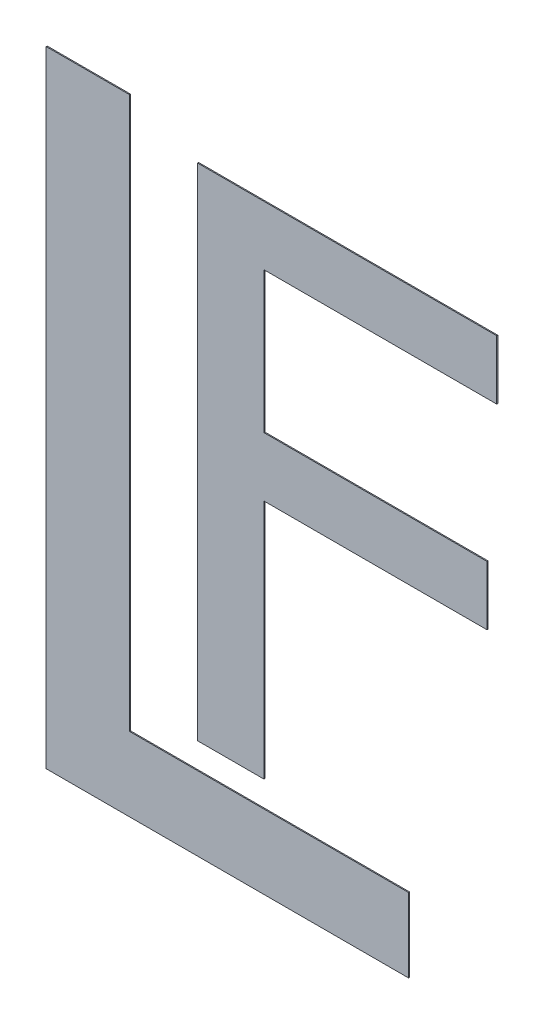
ISO-10303-21;
HEADER;
FILE_DESCRIPTION(('STEP AP214'),'2;1');
FILE_NAME('part.step','',(''),(''),'','','');
FILE_SCHEMA(('AUTOMOTIVE_DESIGN { 1 0 10303 214 1 1 1 1 }'));
ENDSEC;
DATA;
#1=APPLICATION_CONTEXT('core data for automotive mechanical design processes');
#2=APPLICATION_PROTOCOL_DEFINITION('international standard','automotive_design',2000,#1);
#3=PRODUCT_CONTEXT('',#1,'mechanical');
#4=PRODUCT('Part','Part','',(#3));
#5=PRODUCT_RELATED_PRODUCT_CATEGORY('part','',(#4));
#6=PRODUCT_DEFINITION_FORMATION('','',#4);
#7=PRODUCT_DEFINITION_CONTEXT('part definition',#1,'design');
#8=PRODUCT_DEFINITION('design','',#6,#7);
#9=PRODUCT_DEFINITION_SHAPE('','',#8);
#10=(LENGTH_UNIT() NAMED_UNIT(*) SI_UNIT(.MILLI.,.METRE.));
#11=(NAMED_UNIT(*) PLANE_ANGLE_UNIT() SI_UNIT($,.RADIAN.));
#12=(NAMED_UNIT(*) SI_UNIT($,.STERADIAN.) SOLID_ANGLE_UNIT());
#13=UNCERTAINTY_MEASURE_WITH_UNIT(LENGTH_MEASURE(1.E-05),#10,'distance_accuracy_value','');
#14=(GEOMETRIC_REPRESENTATION_CONTEXT(3) GLOBAL_UNCERTAINTY_ASSIGNED_CONTEXT((#13)) GLOBAL_UNIT_ASSIGNED_CONTEXT((#10,
#11,#12)) REPRESENTATION_CONTEXT('',''));
#15=CARTESIAN_POINT('',(0.,0.,0.));
#16=DIRECTION('',(0.,0.,1.));
#17=DIRECTION('',(1.,0.,0.));
#18=AXIS2_PLACEMENT_3D('',#15,#16,#17);
#19=CARTESIAN_POINT('',(43.793430936841,80.359045830716,1.999));
#20=DIRECTION('',(0.,0.,-1.));
#21=DIRECTION('',(-1.,0.,0.));
#22=AXIS2_PLACEMENT_3D('',#19,#20,#21);
#23=PLANE('',#22);
#24=DIRECTION('',(-0.999999999999985,-1.74845553146897E-07,0.));
#25=VECTOR('',#24,1.);
#26=CARTESIAN_POINT('',(44.298592540433,80.045644066559,1.999));
#27=LINE('',#26,#25);
#28=CARTESIAN_POINT('',(44.2985925404329,80.045644066559,1.999));
#29=VERTEX_POINT('',#28);
#30=CARTESIAN_POINT('',(43.754200948274,80.0456439713748,1.999));
#31=VERTEX_POINT('',#30);
#32=EDGE_CURVE('P0_E106',#29,#31,#27,.T.);
#33=ORIENTED_EDGE('',*,*,#32,.F.);
#34=DIRECTION('',(-1.74845553146897E-07,0.999999999999985,0.));
#35=VECTOR('',#34,1.);
#36=CARTESIAN_POINT('',(44.298592565654,79.901395114735,1.999));
#37=LINE('',#36,#35);
#38=CARTESIAN_POINT('',(44.298592565654,79.9013951147351,1.999));
#39=VERTEX_POINT('',#38);
#40=EDGE_CURVE('P0_E76',#39,#29,#37,.T.);
#41=ORIENTED_EDGE('',*,*,#40,.F.);
#42=DIRECTION('',(0.999999999999985,1.74845553146897E-07,0.));
#43=VECTOR('',#42,1.);
#44=CARTESIAN_POINT('',(43.592167904323,79.90139499122,1.999));
#45=LINE('',#44,#43);
#46=CARTESIAN_POINT('',(43.5921679043227,79.90139499122,1.999));
#47=VERTEX_POINT('',#46);
#48=EDGE_CURVE('P0_E73',#47,#39,#45,.T.);
#49=ORIENTED_EDGE('',*,*,#48,.F.);
#50=DIRECTION('',(1.74845553146897E-07,-0.999999999999985,0.));
#51=VECTOR('',#50,1.);
#52=CARTESIAN_POINT('',(43.592167691151,81.12059503609,1.999));
#53=LINE('',#52,#51);
#54=CARTESIAN_POINT('',(43.592167691151,81.1205950360901,1.999));
#55=VERTEX_POINT('',#54);
#56=EDGE_CURVE('P0_E89',#55,#47,#53,.T.);
#57=ORIENTED_EDGE('',*,*,#56,.F.);
#58=DIRECTION('',(-0.999999999999985,-1.74845553146897E-07,0.));
#59=VECTOR('',#58,1.);
#60=CARTESIAN_POINT('',(43.754200760324,81.120595064421,1.999));
#61=LINE('',#60,#59);
#62=CARTESIAN_POINT('',(43.7542007603238,81.120595064421,1.999));
#63=VERTEX_POINT('',#62);
#64=EDGE_CURVE('P0_E95',#63,#55,#61,.T.);
#65=ORIENTED_EDGE('',*,*,#64,.F.);
#66=DIRECTION('',(-1.74845553146897E-07,0.999999999999985,0.));
#67=VECTOR('',#66,1.);
#68=CARTESIAN_POINT('',(43.754200948274,80.045643971375,1.999));
#69=LINE('',#68,#67);
#70=EDGE_CURVE('P0_E102',#31,#63,#69,.T.);
#71=ORIENTED_EDGE('',*,*,#70,.F.);
#72=EDGE_LOOP('',(#33,#41,#49,#57,#65,#71));
#73=FACE_BOUND('',#72,.T.);
#74=ADVANCED_FACE('P0_F17',(#73),#23,.T.);
#75=CARTESIAN_POINT('',(43.592167904323,79.90139499122,2.));
#76=DIRECTION('',(1.74845553146897E-07,-0.999999999999985,0.));
#77=DIRECTION('',(0.999999999999985,1.74845553146897E-07,0.));
#78=AXIS2_PLACEMENT_3D('',#75,#76,#77);
#79=PLANE('',#78);
#80=DIRECTION('',(0.,0.,1.));
#81=VECTOR('',#80,1.);
#82=CARTESIAN_POINT('',(43.5921679043227,79.90139499122,2.));
#83=LINE('',#82,#81);
#84=CARTESIAN_POINT('',(43.5921677977368,79.90139499122,2.001));
#85=VERTEX_POINT('',#84);
#86=EDGE_CURVE('P0_E97',#47,#85,#83,.T.);
#87=ORIENTED_EDGE('',*,*,#86,.F.);
#88=ORIENTED_EDGE('',*,*,#48,.T.);
#89=DIRECTION('',(0.,0.,1.));
#90=VECTOR('',#89,1.);
#91=CARTESIAN_POINT('',(44.298592565654,79.901395114735,2.));
#92=LINE('',#91,#90);
#93=CARTESIAN_POINT('',(44.298592565654,79.9013950529775,2.001));
#94=VERTEX_POINT('',#93);
#95=EDGE_CURVE('P0_E20',#94,#39,#92,.F.);
#96=ORIENTED_EDGE('',*,*,#95,.F.);
#97=DIRECTION('',(1.,0.,0.));
#98=VECTOR('',#97,1.);
#99=CARTESIAN_POINT('',(43.793430936841,79.90139499122,2.001));
#100=LINE('',#99,#98);
#101=EDGE_CURVE('P0_E71',#85,#94,#100,.T.);
#102=ORIENTED_EDGE('',*,*,#101,.F.);
#103=EDGE_LOOP('',(#87,#88,#96,#102));
#104=FACE_BOUND('',#103,.T.);
#105=ADVANCED_FACE('P0_F69',(#104),#79,.T.);
#106=CARTESIAN_POINT('',(44.298592565654,79.901395114735,2.));
#107=DIRECTION('',(0.999999999999985,1.74845553146897E-07,0.));
#108=DIRECTION('',(-1.74845553146897E-07,0.999999999999985,0.));
#109=AXIS2_PLACEMENT_3D('',#106,#107,#108);
#110=PLANE('',#109);
#111=ORIENTED_EDGE('',*,*,#95,.T.);
#112=ORIENTED_EDGE('',*,*,#40,.T.);
#113=DIRECTION('',(0.,0.,1.));
#114=VECTOR('',#113,1.);
#115=CARTESIAN_POINT('',(44.298592540433,80.045644066559,2.));
#116=LINE('',#115,#114);
#117=CARTESIAN_POINT('',(44.2985925530435,80.045644066559,2.001));
#118=VERTEX_POINT('',#117);
#119=EDGE_CURVE('P0_E81',#118,#29,#116,.F.);
#120=ORIENTED_EDGE('',*,*,#119,.F.);
#121=DIRECTION('',(0.,1.,0.));
#122=VECTOR('',#121,1.);
#123=CARTESIAN_POINT('',(44.298592565654,80.359045830716,2.001));
#124=LINE('',#123,#122);
#125=EDGE_CURVE('P0_E78',#94,#118,#124,.T.);
#126=ORIENTED_EDGE('',*,*,#125,.F.);
#127=EDGE_LOOP('',(#111,#112,#120,#126));
#128=FACE_BOUND('',#127,.T.);
#129=ADVANCED_FACE('P0_F79',(#128),#110,.T.);
#130=CARTESIAN_POINT('',(44.298592540433,80.045644066559,2.));
#131=DIRECTION('',(-1.74845553146897E-07,0.999999999999985,0.));
#132=DIRECTION('',(-0.999999999999985,-1.74845553146897E-07,0.));
#133=AXIS2_PLACEMENT_3D('',#130,#131,#132);
#134=PLANE('',#133);
#135=ORIENTED_EDGE('',*,*,#119,.T.);
#136=ORIENTED_EDGE('',*,*,#32,.T.);
#137=DIRECTION('',(0.,0.,1.));
#138=VECTOR('',#137,1.);
#139=CARTESIAN_POINT('',(43.754200948274,80.045643971375,2.));
#140=LINE('',#139,#138);
#141=CARTESIAN_POINT('',(43.754200948274,80.045644018967,2.001));
#142=VERTEX_POINT('',#141);
#143=EDGE_CURVE('P0_E104',#142,#31,#140,.F.);
#144=ORIENTED_EDGE('',*,*,#143,.F.);
#145=DIRECTION('',(1.,0.,0.));
#146=VECTOR('',#145,1.);
#147=CARTESIAN_POINT('',(43.793430936841,80.045644066559,2.001));
#148=LINE('',#147,#146);
#149=EDGE_CURVE('P0_E85',#118,#142,#148,.F.);
#150=ORIENTED_EDGE('',*,*,#149,.F.);
#151=EDGE_LOOP('',(#135,#136,#144,#150));
#152=FACE_BOUND('',#151,.T.);
#153=ADVANCED_FACE('P0_F116',(#152),#134,.T.);
#154=CARTESIAN_POINT('',(43.754200948274,80.045643971375,2.));
#155=DIRECTION('',(0.999999999999985,1.74845553146897E-07,0.));
#156=DIRECTION('',(-1.74845553146897E-07,0.999999999999985,0.));
#157=AXIS2_PLACEMENT_3D('',#154,#155,#156);
#158=PLANE('',#157);
#159=ORIENTED_EDGE('',*,*,#143,.T.);
#160=ORIENTED_EDGE('',*,*,#70,.T.);
#161=DIRECTION('',(0.,0.,1.));
#162=VECTOR('',#161,1.);
#163=CARTESIAN_POINT('',(43.754200760324,81.120595064421,2.));
#164=LINE('',#163,#162);
#165=CARTESIAN_POINT('',(43.754200854299,81.120595064421,2.001));
#166=VERTEX_POINT('',#165);
#167=EDGE_CURVE('P0_E98',#166,#63,#164,.F.);
#168=ORIENTED_EDGE('',*,*,#167,.F.);
#169=DIRECTION('',(0.,1.,0.));
#170=VECTOR('',#169,1.);
#171=CARTESIAN_POINT('',(43.754200948274,80.359045830716,2.001));
#172=LINE('',#171,#170);
#173=EDGE_CURVE('P0_E99',#142,#166,#172,.T.);
#174=ORIENTED_EDGE('',*,*,#173,.F.);
#175=EDGE_LOOP('',(#159,#160,#168,#174));
#176=FACE_BOUND('',#175,.T.);
#177=ADVANCED_FACE('P0_F121',(#176),#158,.T.);
#178=CARTESIAN_POINT('',(43.754200760324,81.120595064421,2.));
#179=DIRECTION('',(-1.74845553146897E-07,0.999999999999985,0.));
#180=DIRECTION('',(-0.999999999999985,-1.74845553146897E-07,0.));
#181=AXIS2_PLACEMENT_3D('',#178,#179,#180);
#182=PLANE('',#181);
#183=ORIENTED_EDGE('',*,*,#167,.T.);
#184=ORIENTED_EDGE('',*,*,#64,.T.);
#185=DIRECTION('',(0.,0.,1.));
#186=VECTOR('',#185,1.);
#187=CARTESIAN_POINT('',(43.592167691151,81.12059503609,2.));
#188=LINE('',#187,#186);
#189=CARTESIAN_POINT('',(43.592167691151,81.1205950502555,2.001));
#190=VERTEX_POINT('',#189);
#191=EDGE_CURVE('P0_E35',#190,#55,#188,.F.);
#192=ORIENTED_EDGE('',*,*,#191,.F.);
#193=DIRECTION('',(1.,0.,0.));
#194=VECTOR('',#193,1.);
#195=CARTESIAN_POINT('',(43.793430936841,81.120595064421,2.001));
#196=LINE('',#195,#194);
#197=EDGE_CURVE('P0_E26',#166,#190,#196,.F.);
#198=ORIENTED_EDGE('',*,*,#197,.F.);
#199=EDGE_LOOP('',(#183,#184,#192,#198));
#200=FACE_BOUND('',#199,.T.);
#201=ADVANCED_FACE('P0_F123',(#200),#182,.T.);
#202=CARTESIAN_POINT('',(43.592167691151,81.12059503609,2.));
#203=DIRECTION('',(-0.999999999999985,-1.74845553146897E-07,0.));
#204=DIRECTION('',(1.74845553146897E-07,-0.999999999999985,0.));
#205=AXIS2_PLACEMENT_3D('',#202,#203,#204);
#206=PLANE('',#205);
#207=ORIENTED_EDGE('',*,*,#191,.T.);
#208=ORIENTED_EDGE('',*,*,#56,.T.);
#209=ORIENTED_EDGE('',*,*,#86,.T.);
#210=DIRECTION('',(0.,1.,0.));
#211=VECTOR('',#210,1.);
#212=CARTESIAN_POINT('',(43.592167691151,80.359045830716,2.001));
#213=LINE('',#212,#211);
#214=EDGE_CURVE('P0_E11',#190,#85,#213,.F.);
#215=ORIENTED_EDGE('',*,*,#214,.F.);
#216=EDGE_LOOP('',(#207,#208,#209,#215));
#217=FACE_BOUND('',#216,.T.);
#218=ADVANCED_FACE('P0_F125',(#217),#206,.T.);
#219=CARTESIAN_POINT('',(43.793430936841,80.359045830716,2.001));
#220=DIRECTION('',(0.,0.,1.));
#221=DIRECTION('',(1.,0.,0.));
#222=AXIS2_PLACEMENT_3D('',#219,#220,#221);
#223=PLANE('',#222);
#224=ORIENTED_EDGE('',*,*,#197,.T.);
#225=ORIENTED_EDGE('',*,*,#214,.T.);
#226=ORIENTED_EDGE('',*,*,#101,.T.);
#227=ORIENTED_EDGE('',*,*,#125,.T.);
#228=ORIENTED_EDGE('',*,*,#149,.T.);
#229=ORIENTED_EDGE('',*,*,#173,.T.);
#230=EDGE_LOOP('',(#224,#225,#226,#227,#228,#229));
#231=FACE_BOUND('',#230,.T.);
#232=ADVANCED_FACE('P0_F88',(#231),#223,.T.);
#233=CLOSED_SHELL('',(#74,#105,#129,#153,#177,#201,#218,#232));
#234=MANIFOLD_SOLID_BREP('P0_B1',#233);
#235=CARTESIAN_POINT('',(44.105464989644,80.690311335437,1.999));
#236=DIRECTION('',(0.,0.,-1.));
#237=DIRECTION('',(-1.,0.,0.));
#238=AXIS2_PLACEMENT_3D('',#235,#236,#237);
#239=PLANE('',#238);
#240=DIRECTION('',(-0.999999999999985,-1.74845553146897E-07,0.));
#241=VECTOR('',#240,1.);
#242=CARTESIAN_POINT('',(44.470337538235,81.071510489465,1.999));
#243=LINE('',#242,#241);
#244=CARTESIAN_POINT('',(44.470337538235,81.071510489465,1.999));
#245=VERTEX_POINT('',#244);
#246=CARTESIAN_POINT('',(43.887018480302,81.0715103874741,1.999));
#247=VERTEX_POINT('',#246);
#248=EDGE_CURVE('P1_E154',#245,#247,#243,.T.);
#249=ORIENTED_EDGE('',*,*,#248,.F.);
#250=DIRECTION('',(-1.74845553146897E-07,0.999999999999985,0.));
#251=VECTOR('',#250,1.);
#252=CARTESIAN_POINT('',(44.470337558412,80.956111326242,1.999));
#253=LINE('',#252,#251);
#254=CARTESIAN_POINT('',(44.470337558412,80.9561113262421,1.999));
#255=VERTEX_POINT('',#254);
#256=EDGE_CURVE('P1_E100',#255,#245,#253,.T.);
#257=ORIENTED_EDGE('',*,*,#256,.F.);
#258=DIRECTION('',(0.999999999999985,1.74845553146897E-07,0.));
#259=VECTOR('',#258,1.);
#260=CARTESIAN_POINT('',(44.016644957798,80.956111246916,1.999));
#261=LINE('',#260,#259);
#262=CARTESIAN_POINT('',(44.0166449577978,80.956111246916,1.999));
#263=VERTEX_POINT('',#262);
#264=EDGE_CURVE('P1_E97',#263,#255,#261,.T.);
#265=ORIENTED_EDGE('',*,*,#264,.F.);
#266=DIRECTION('',(-1.74845553146897E-07,0.999999999999985,0.));
#267=VECTOR('',#266,1.);
#268=CARTESIAN_POINT('',(44.016645005891,80.681050227728,1.999));
#269=LINE('',#268,#267);
#270=CARTESIAN_POINT('',(44.016645005891,80.6810502277283,1.999));
#271=VERTEX_POINT('',#270);
#272=EDGE_CURVE('P1_E113',#271,#263,#269,.T.);
#273=ORIENTED_EDGE('',*,*,#272,.F.);
#274=DIRECTION('',(-0.999999999999985,-1.74845553146897E-07,0.));
#275=VECTOR('',#274,1.);
#276=CARTESIAN_POINT('',(44.451367881044,80.681050303738,1.999));
#277=LINE('',#276,#275);
#278=CARTESIAN_POINT('',(44.451367881044,80.681050303738,1.999));
#279=VERTEX_POINT('',#278);
#280=EDGE_CURVE('P1_E119',#279,#271,#277,.T.);
#281=ORIENTED_EDGE('',*,*,#280,.F.);
#282=DIRECTION('',(-1.74845553146897E-07,0.999999999999985,0.));
#283=VECTOR('',#282,1.);
#284=CARTESIAN_POINT('',(44.451367901221,80.565651140515,1.999));
#285=LINE('',#284,#283);
#286=CARTESIAN_POINT('',(44.451367901221,80.5656511405152,1.999));
#287=VERTEX_POINT('',#286);
#288=EDGE_CURVE('P1_E127',#287,#279,#285,.T.);
#289=ORIENTED_EDGE('',*,*,#288,.F.);
#290=DIRECTION('',(0.999999999999985,1.74845553146897E-07,0.));
#291=VECTOR('',#290,1.);
#292=CARTESIAN_POINT('',(44.016645026068,80.565651064506,1.999));
#293=LINE('',#292,#291);
#294=CARTESIAN_POINT('',(44.0166450260679,80.565651064506,1.999));
#295=VERTEX_POINT('',#294);
#296=EDGE_CURVE('P1_E133',#295,#287,#293,.T.);
#297=ORIENTED_EDGE('',*,*,#296,.F.);
#298=DIRECTION('',(-1.74845553146897E-07,0.999999999999985,0.));
#299=VECTOR('',#298,1.);
#300=CARTESIAN_POINT('',(44.016645108158,80.096150359341,1.999));
#301=LINE('',#300,#299);
#302=CARTESIAN_POINT('',(44.016645108158,80.0961503593408,1.999));
#303=VERTEX_POINT('',#302);
#304=EDGE_CURVE('P1_E139',#303,#295,#301,.T.);
#305=ORIENTED_EDGE('',*,*,#304,.F.);
#306=DIRECTION('',(0.999999999999985,1.74845553146897E-07,0.));
#307=VECTOR('',#306,1.);
#308=CARTESIAN_POINT('',(43.88701865084,80.096150336676,1.999));
#309=LINE('',#308,#307);
#310=CARTESIAN_POINT('',(43.8870186508397,80.096150336676,1.999));
#311=VERTEX_POINT('',#310);
#312=EDGE_CURVE('P1_E145',#311,#303,#309,.T.);
#313=ORIENTED_EDGE('',*,*,#312,.F.);
#314=DIRECTION('',(1.74845553146897E-07,-0.999999999999985,0.));
#315=VECTOR('',#314,1.);
#316=CARTESIAN_POINT('',(43.887018480302,81.071510387474,1.999));
#317=LINE('',#316,#315);
#318=EDGE_CURVE('P1_E150',#247,#311,#317,.T.);
#319=ORIENTED_EDGE('',*,*,#318,.F.);
#320=EDGE_LOOP('',(#249,#257,#265,#273,#281,#289,#297,#305,#313,#319));
#321=FACE_BOUND('',#320,.T.);
#322=ADVANCED_FACE('P1_F17',(#321),#239,.T.);
#323=CARTESIAN_POINT('',(44.016644957798,80.956111246916,2.));
#324=DIRECTION('',(1.74845553146897E-07,-0.999999999999985,0.));
#325=DIRECTION('',(0.999999999999985,1.74845553146897E-07,0.));
#326=AXIS2_PLACEMENT_3D('',#323,#324,#325);
#327=PLANE('',#326);
#328=DIRECTION('',(0.,0.,1.));
#329=VECTOR('',#328,1.);
#330=CARTESIAN_POINT('',(44.0166449577978,80.956111246916,2.));
#331=LINE('',#330,#329);
#332=CARTESIAN_POINT('',(44.0166449818444,80.956111246916,2.001));
#333=VERTEX_POINT('',#332);
#334=EDGE_CURVE('P1_E121',#263,#333,#331,.T.);
#335=ORIENTED_EDGE('',*,*,#334,.F.);
#336=ORIENTED_EDGE('',*,*,#264,.T.);
#337=DIRECTION('',(0.,0.,1.));
#338=VECTOR('',#337,1.);
#339=CARTESIAN_POINT('',(44.470337558412,80.956111326242,2.));
#340=LINE('',#339,#338);
#341=CARTESIAN_POINT('',(44.470337558412,80.956111286579,2.001));
#342=VERTEX_POINT('',#341);
#343=EDGE_CURVE('P1_E20',#342,#255,#340,.F.);
#344=ORIENTED_EDGE('',*,*,#343,.F.);
#345=DIRECTION('',(1.,0.,0.));
#346=VECTOR('',#345,1.);
#347=CARTESIAN_POINT('',(44.105464989644,80.956111246916,2.001));
#348=LINE('',#347,#346);
#349=EDGE_CURVE('P1_E95',#333,#342,#348,.T.);
#350=ORIENTED_EDGE('',*,*,#349,.F.);
#351=EDGE_LOOP('',(#335,#336,#344,#350));
#352=FACE_BOUND('',#351,.T.);
#353=ADVANCED_FACE('P1_F93',(#352),#327,.T.);
#354=CARTESIAN_POINT('',(44.470337558412,80.956111326242,2.));
#355=DIRECTION('',(0.999999999999985,1.74845553146897E-07,0.));
#356=DIRECTION('',(-1.74845553146897E-07,0.999999999999985,0.));
#357=AXIS2_PLACEMENT_3D('',#354,#355,#356);
#358=PLANE('',#357);
#359=ORIENTED_EDGE('',*,*,#343,.T.);
#360=ORIENTED_EDGE('',*,*,#256,.T.);
#361=DIRECTION('',(0.,0.,1.));
#362=VECTOR('',#361,1.);
#363=CARTESIAN_POINT('',(44.470337538235,81.071510489465,2.));
#364=LINE('',#363,#362);
#365=CARTESIAN_POINT('',(44.4703375483235,81.071510489465,2.001));
#366=VERTEX_POINT('',#365);
#367=EDGE_CURVE('P1_E105',#366,#245,#364,.F.);
#368=ORIENTED_EDGE('',*,*,#367,.F.);
#369=DIRECTION('',(0.,1.,0.));
#370=VECTOR('',#369,1.);
#371=CARTESIAN_POINT('',(44.470337558412,80.690311335437,2.001));
#372=LINE('',#371,#370);
#373=EDGE_CURVE('P1_E102',#342,#366,#372,.T.);
#374=ORIENTED_EDGE('',*,*,#373,.F.);
#375=EDGE_LOOP('',(#359,#360,#368,#374));
#376=FACE_BOUND('',#375,.T.);
#377=ADVANCED_FACE('P1_F103',(#376),#358,.T.);
#378=CARTESIAN_POINT('',(44.470337538235,81.071510489465,2.));
#379=DIRECTION('',(-1.74845553146897E-07,0.999999999999985,0.));
#380=DIRECTION('',(-0.999999999999985,-1.74845553146897E-07,0.));
#381=AXIS2_PLACEMENT_3D('',#378,#379,#380);
#382=PLANE('',#381);
#383=ORIENTED_EDGE('',*,*,#367,.T.);
#384=ORIENTED_EDGE('',*,*,#248,.T.);
#385=DIRECTION('',(0.,0.,1.));
#386=VECTOR('',#385,1.);
#387=CARTESIAN_POINT('',(43.887018480302,81.071510387474,2.));
#388=LINE('',#387,#386);
#389=CARTESIAN_POINT('',(43.887018480302,81.0715104384695,2.001));
#390=VERTEX_POINT('',#389);
#391=EDGE_CURVE('P1_E152',#390,#247,#388,.F.);
#392=ORIENTED_EDGE('',*,*,#391,.F.);
#393=DIRECTION('',(1.,0.,0.));
#394=VECTOR('',#393,1.);
#395=CARTESIAN_POINT('',(44.105464989644,81.071510489465,2.001));
#396=LINE('',#395,#394);
#397=EDGE_CURVE('P1_E109',#366,#390,#396,.F.);
#398=ORIENTED_EDGE('',*,*,#397,.F.);
#399=EDGE_LOOP('',(#383,#384,#392,#398));
#400=FACE_BOUND('',#399,.T.);
#401=ADVANCED_FACE('P1_F172',(#400),#382,.T.);
#402=CARTESIAN_POINT('',(43.887018480302,81.071510387474,2.));
#403=DIRECTION('',(-0.999999999999985,-1.74845553146897E-07,0.));
#404=DIRECTION('',(1.74845553146897E-07,-0.999999999999985,0.));
#405=AXIS2_PLACEMENT_3D('',#402,#403,#404);
#406=PLANE('',#405);
#407=ORIENTED_EDGE('',*,*,#391,.T.);
#408=ORIENTED_EDGE('',*,*,#318,.T.);
#409=DIRECTION('',(0.,0.,1.));
#410=VECTOR('',#409,1.);
#411=CARTESIAN_POINT('',(43.88701865084,80.096150336676,2.));
#412=LINE('',#411,#410);
#413=CARTESIAN_POINT('',(43.887018565571,80.096150336676,2.001));
#414=VERTEX_POINT('',#413);
#415=EDGE_CURVE('P1_E147',#414,#311,#412,.F.);
#416=ORIENTED_EDGE('',*,*,#415,.F.);
#417=DIRECTION('',(0.,1.,0.));
#418=VECTOR('',#417,1.);
#419=CARTESIAN_POINT('',(43.887018480302,80.690311335437,2.001));
#420=LINE('',#419,#418);
#421=EDGE_CURVE('P1_E144',#390,#414,#420,.F.);
#422=ORIENTED_EDGE('',*,*,#421,.F.);
#423=EDGE_LOOP('',(#407,#408,#416,#422));
#424=FACE_BOUND('',#423,.T.);
#425=ADVANCED_FACE('P1_F178',(#424),#406,.T.);
#426=CARTESIAN_POINT('',(43.88701865084,80.096150336676,2.));
#427=DIRECTION('',(1.74845553146897E-07,-0.999999999999985,0.));
#428=DIRECTION('',(0.999999999999985,1.74845553146897E-07,0.));
#429=AXIS2_PLACEMENT_3D('',#426,#427,#428);
#430=PLANE('',#429);
#431=ORIENTED_EDGE('',*,*,#415,.T.);
#432=ORIENTED_EDGE('',*,*,#312,.T.);
#433=DIRECTION('',(0.,0.,1.));
#434=VECTOR('',#433,1.);
#435=CARTESIAN_POINT('',(44.016645108158,80.096150359341,2.));
#436=LINE('',#435,#434);
#437=CARTESIAN_POINT('',(44.016645108158,80.0961503480085,2.001));
#438=VERTEX_POINT('',#437);
#439=EDGE_CURVE('P1_E141',#438,#303,#436,.F.);
#440=ORIENTED_EDGE('',*,*,#439,.F.);
#441=DIRECTION('',(1.,0.,0.));
#442=VECTOR('',#441,1.);
#443=CARTESIAN_POINT('',(44.105464989644,80.096150336676,2.001));
#444=LINE('',#443,#442);
#445=EDGE_CURVE('P1_E138',#414,#438,#444,.T.);
#446=ORIENTED_EDGE('',*,*,#445,.F.);
#447=EDGE_LOOP('',(#431,#432,#440,#446));
#448=FACE_BOUND('',#447,.T.);
#449=ADVANCED_FACE('P1_F181',(#448),#430,.T.);
#450=CARTESIAN_POINT('',(44.016645108158,80.096150359341,2.));
#451=DIRECTION('',(0.999999999999985,1.74845553146897E-07,0.));
#452=DIRECTION('',(-1.74845553146897E-07,0.999999999999985,0.));
#453=AXIS2_PLACEMENT_3D('',#450,#451,#452);
#454=PLANE('',#453);
#455=ORIENTED_EDGE('',*,*,#439,.T.);
#456=ORIENTED_EDGE('',*,*,#304,.T.);
#457=DIRECTION('',(0.,0.,1.));
#458=VECTOR('',#457,1.);
#459=CARTESIAN_POINT('',(44.016645026068,80.565651064506,2.));
#460=LINE('',#459,#458);
#461=CARTESIAN_POINT('',(44.016645067113,80.565651064506,2.001));
#462=VERTEX_POINT('',#461);
#463=EDGE_CURVE('P1_E135',#462,#295,#460,.F.);
#464=ORIENTED_EDGE('',*,*,#463,.F.);
#465=DIRECTION('',(0.,1.,0.));
#466=VECTOR('',#465,1.);
#467=CARTESIAN_POINT('',(44.016645108158,80.690311335437,2.001));
#468=LINE('',#467,#466);
#469=EDGE_CURVE('P1_E132',#438,#462,#468,.T.);
#470=ORIENTED_EDGE('',*,*,#469,.F.);
#471=EDGE_LOOP('',(#455,#456,#464,#470));
#472=FACE_BOUND('',#471,.T.);
#473=ADVANCED_FACE('P1_F185',(#472),#454,.T.);
#474=CARTESIAN_POINT('',(44.016645026068,80.565651064506,2.));
#475=DIRECTION('',(1.74845553146897E-07,-0.999999999999985,0.));
#476=DIRECTION('',(0.999999999999985,1.74845553146897E-07,0.));
#477=AXIS2_PLACEMENT_3D('',#474,#475,#476);
#478=PLANE('',#477);
#479=ORIENTED_EDGE('',*,*,#463,.T.);
#480=ORIENTED_EDGE('',*,*,#296,.T.);
#481=DIRECTION('',(0.,0.,1.));
#482=VECTOR('',#481,1.);
#483=CARTESIAN_POINT('',(44.451367901221,80.565651140515,2.));
#484=LINE('',#483,#482);
#485=CARTESIAN_POINT('',(44.451367901221,80.5656511025105,2.001));
#486=VERTEX_POINT('',#485);
#487=EDGE_CURVE('P1_E129',#486,#287,#484,.F.);
#488=ORIENTED_EDGE('',*,*,#487,.F.);
#489=DIRECTION('',(1.,0.,0.));
#490=VECTOR('',#489,1.);
#491=CARTESIAN_POINT('',(44.105464989644,80.565651064506,2.001));
#492=LINE('',#491,#490);
#493=EDGE_CURVE('P1_E126',#462,#486,#492,.T.);
#494=ORIENTED_EDGE('',*,*,#493,.F.);
#495=EDGE_LOOP('',(#479,#480,#488,#494));
#496=FACE_BOUND('',#495,.T.);
#497=ADVANCED_FACE('P1_F189',(#496),#478,.T.);
#498=CARTESIAN_POINT('',(44.451367901221,80.565651140515,2.));
#499=DIRECTION('',(0.999999999999985,1.74845553146897E-07,0.));
#500=DIRECTION('',(-1.74845553146897E-07,0.999999999999985,0.));
#501=AXIS2_PLACEMENT_3D('',#498,#499,#500);
#502=PLANE('',#501);
#503=ORIENTED_EDGE('',*,*,#487,.T.);
#504=ORIENTED_EDGE('',*,*,#288,.T.);
#505=DIRECTION('',(0.,0.,1.));
#506=VECTOR('',#505,1.);
#507=CARTESIAN_POINT('',(44.451367881044,80.681050303738,2.));
#508=LINE('',#507,#506);
#509=CARTESIAN_POINT('',(44.4513678911325,80.681050303738,2.001));
#510=VERTEX_POINT('',#509);
#511=EDGE_CURVE('P1_E122',#510,#279,#508,.F.);
#512=ORIENTED_EDGE('',*,*,#511,.F.);
#513=DIRECTION('',(0.,1.,0.));
#514=VECTOR('',#513,1.);
#515=CARTESIAN_POINT('',(44.451367901221,80.690311335437,2.001));
#516=LINE('',#515,#514);
#517=EDGE_CURVE('P1_E123',#486,#510,#516,.T.);
#518=ORIENTED_EDGE('',*,*,#517,.F.);
#519=EDGE_LOOP('',(#503,#504,#512,#518));
#520=FACE_BOUND('',#519,.T.);
#521=ADVANCED_FACE('P1_F193',(#520),#502,.T.);
#522=CARTESIAN_POINT('',(44.451367881044,80.681050303738,2.));
#523=DIRECTION('',(-1.74845553146897E-07,0.999999999999985,0.));
#524=DIRECTION('',(-0.999999999999985,-1.74845553146897E-07,0.));
#525=AXIS2_PLACEMENT_3D('',#522,#523,#524);
#526=PLANE('',#525);
#527=ORIENTED_EDGE('',*,*,#511,.T.);
#528=ORIENTED_EDGE('',*,*,#280,.T.);
#529=DIRECTION('',(0.,0.,1.));
#530=VECTOR('',#529,1.);
#531=CARTESIAN_POINT('',(44.016645005891,80.681050227728,2.));
#532=LINE('',#531,#530);
#533=CARTESIAN_POINT('',(44.016645005891,80.681050265733,2.001));
#534=VERTEX_POINT('',#533);
#535=EDGE_CURVE('P1_E35',#534,#271,#532,.F.);
#536=ORIENTED_EDGE('',*,*,#535,.F.);
#537=DIRECTION('',(1.,0.,0.));
#538=VECTOR('',#537,1.);
#539=CARTESIAN_POINT('',(44.105464989644,80.681050303738,2.001));
#540=LINE('',#539,#538);
#541=EDGE_CURVE('P1_E26',#510,#534,#540,.F.);
#542=ORIENTED_EDGE('',*,*,#541,.F.);
#543=EDGE_LOOP('',(#527,#528,#536,#542));
#544=FACE_BOUND('',#543,.T.);
#545=ADVANCED_FACE('P1_F195',(#544),#526,.T.);
#546=CARTESIAN_POINT('',(44.016645005891,80.681050227728,2.));
#547=DIRECTION('',(0.999999999999985,1.74845553146897E-07,0.));
#548=DIRECTION('',(-1.74845553146897E-07,0.999999999999985,0.));
#549=AXIS2_PLACEMENT_3D('',#546,#547,#548);
#550=PLANE('',#549);
#551=ORIENTED_EDGE('',*,*,#535,.T.);
#552=ORIENTED_EDGE('',*,*,#272,.T.);
#553=ORIENTED_EDGE('',*,*,#334,.T.);
#554=DIRECTION('',(0.,1.,0.));
#555=VECTOR('',#554,1.);
#556=CARTESIAN_POINT('',(44.016645005891,80.690311335437,2.001));
#557=LINE('',#556,#555);
#558=EDGE_CURVE('P1_E11',#534,#333,#557,.T.);
#559=ORIENTED_EDGE('',*,*,#558,.F.);
#560=EDGE_LOOP('',(#551,#552,#553,#559));
#561=FACE_BOUND('',#560,.T.);
#562=ADVANCED_FACE('P1_F197',(#561),#550,.T.);
#563=CARTESIAN_POINT('',(44.105464989644,80.690311335437,2.001));
#564=DIRECTION('',(0.,0.,1.));
#565=DIRECTION('',(1.,0.,0.));
#566=AXIS2_PLACEMENT_3D('',#563,#564,#565);
#567=PLANE('',#566);
#568=ORIENTED_EDGE('',*,*,#541,.T.);
#569=ORIENTED_EDGE('',*,*,#558,.T.);
#570=ORIENTED_EDGE('',*,*,#349,.T.);
#571=ORIENTED_EDGE('',*,*,#373,.T.);
#572=ORIENTED_EDGE('',*,*,#397,.T.);
#573=ORIENTED_EDGE('',*,*,#421,.T.);
#574=ORIENTED_EDGE('',*,*,#445,.T.);
#575=ORIENTED_EDGE('',*,*,#469,.T.);
#576=ORIENTED_EDGE('',*,*,#493,.T.);
#577=ORIENTED_EDGE('',*,*,#517,.T.);
#578=EDGE_LOOP('',(#568,#569,#570,#571,#572,#573,#574,#575,#576,#577));
#579=FACE_BOUND('',#578,.T.);
#580=ADVANCED_FACE('P1_F112',(#579),#567,.T.);
#581=CLOSED_SHELL('',(#322,#353,#377,#401,#425,#449,#473,#497,#521,#545,#562,#580));
#582=MANIFOLD_SOLID_BREP('P1_B1',#581);
#583=ADVANCED_BREP_SHAPE_REPRESENTATION('',(#18,#234,#582),#14);
#584=SHAPE_DEFINITION_REPRESENTATION(#9,#583);
ENDSEC;
END-ISO-10303-21;
